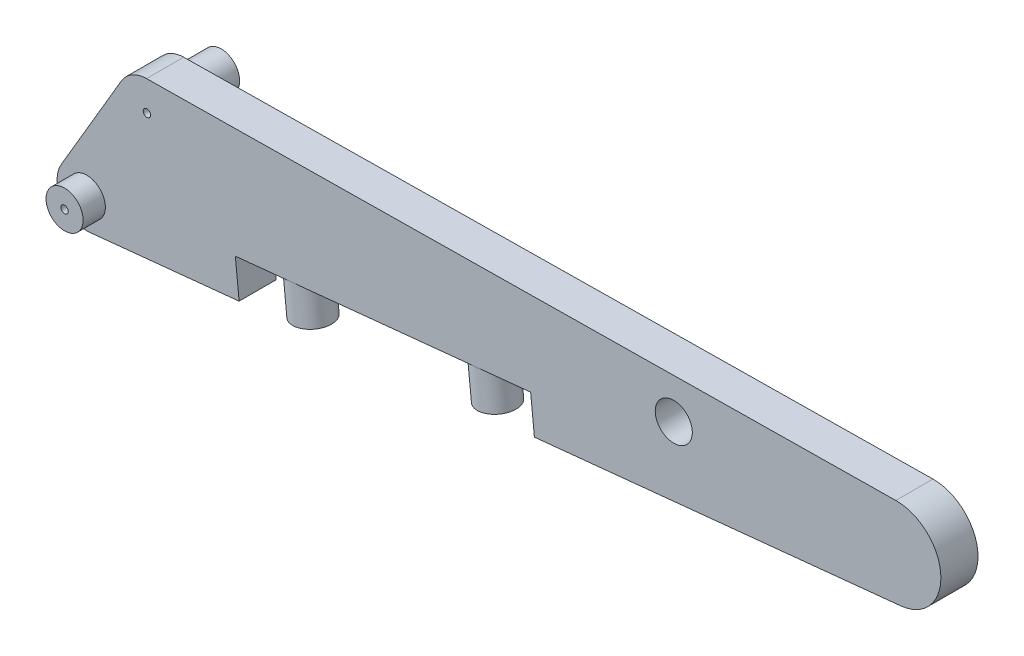
ISO-10303-21;
HEADER;
FILE_DESCRIPTION(('STEP AP214'),'2;1');
FILE_NAME('part.step','',(''),(''),'','','');
FILE_SCHEMA(('AUTOMOTIVE_DESIGN { 1 0 10303 214 1 1 1 1 }'));
ENDSEC;
DATA;
#1=APPLICATION_CONTEXT('core data for automotive mechanical design processes');
#2=APPLICATION_PROTOCOL_DEFINITION('international standard','automotive_design',2000,#1);
#3=PRODUCT_CONTEXT('',#1,'mechanical');
#4=PRODUCT('Part','Part','',(#3));
#5=PRODUCT_RELATED_PRODUCT_CATEGORY('part','',(#4));
#6=PRODUCT_DEFINITION_FORMATION('','',#4);
#7=PRODUCT_DEFINITION_CONTEXT('part definition',#1,'design');
#8=PRODUCT_DEFINITION('design','',#6,#7);
#9=PRODUCT_DEFINITION_SHAPE('','',#8);
#10=(LENGTH_UNIT() NAMED_UNIT(*) SI_UNIT(.MILLI.,.METRE.));
#11=(NAMED_UNIT(*) PLANE_ANGLE_UNIT() SI_UNIT($,.RADIAN.));
#12=(NAMED_UNIT(*) SI_UNIT($,.STERADIAN.) SOLID_ANGLE_UNIT());
#13=UNCERTAINTY_MEASURE_WITH_UNIT(LENGTH_MEASURE(1.E-05),#10,'distance_accuracy_value','');
#14=(GEOMETRIC_REPRESENTATION_CONTEXT(3) GLOBAL_UNCERTAINTY_ASSIGNED_CONTEXT((#13)) GLOBAL_UNIT_ASSIGNED_CONTEXT((#10,
#11,#12)) REPRESENTATION_CONTEXT('',''));
#15=CARTESIAN_POINT('',(0.,0.,0.));
#16=DIRECTION('',(0.,0.,1.));
#17=DIRECTION('',(1.,0.,0.));
#18=AXIS2_PLACEMENT_3D('',#15,#16,#17);
#19=CARTESIAN_POINT('',(51.7116012889555,-6.71364717651734,5.));
#20=DIRECTION('',(-0.100674217274695,0.994919444968349,0.));
#21=DIRECTION('',(-0.994919444968349,-0.100674217274695,0.));
#22=AXIS2_PLACEMENT_3D('',#19,#20,#21);
#23=PLANE('',#22);
#24=CARTESIAN_POINT('',(44.2497054516929,-7.46870380607755,2.5));
#25=DIRECTION('',(0.100674217274695,-0.994919444968349,0.));
#26=DIRECTION('',(0.994919444968349,0.100674217274695,0.));
#27=AXIS2_PLACEMENT_3D('',#24,#25,#26);
#28=CIRCLE('',#27,2.5);
#29=CARTESIAN_POINT('',(44.2497054516929,-7.46870380607755,0.));
#30=VERTEX_POINT('',#29);
#31=CARTESIAN_POINT('',(44.2497054516929,-7.46870380607755,5.));
#32=VERTEX_POINT('',#31);
#33=EDGE_CURVE('E150',#30,#32,#28,.T.);
#34=ORIENTED_EDGE('',*,*,#33,.F.);
#35=DIRECTION('',(0.994919444968349,0.100674217274695,0.));
#36=VECTOR('',#35,1.);
#37=CARTESIAN_POINT('',(51.7116012889555,-6.71364717651734,0.));
#38=LINE('',#37,#36);
#39=CARTESIAN_POINT('',(51.7116012889555,-6.71364717651734,0.));
#40=VERTEX_POINT('',#39);
#41=EDGE_CURVE('E136',#30,#40,#38,.T.);
#42=ORIENTED_EDGE('',*,*,#41,.T.);
#43=DIRECTION('',(0.,0.,-1.));
#44=VECTOR('',#43,1.);
#45=CARTESIAN_POINT('',(51.7116012889555,-6.71364717651734,5.));
#46=LINE('',#45,#44);
#47=CARTESIAN_POINT('',(51.7116012889555,-6.71364717651734,5.));
#48=VERTEX_POINT('',#47);
#49=EDGE_CURVE('E199',#48,#40,#46,.T.);
#50=ORIENTED_EDGE('',*,*,#49,.F.);
#51=DIRECTION('',(0.994919444968349,0.100674217274695,0.));
#52=VECTOR('',#51,1.);
#53=CARTESIAN_POINT('',(51.7116012889555,-6.71364717651734,5.));
#54=LINE('',#53,#52);
#55=EDGE_CURVE('E151',#32,#48,#54,.T.);
#56=ORIENTED_EDGE('',*,*,#55,.F.);
#57=EDGE_LOOP('',(#34,#42,#50,#56));
#58=FACE_BOUND('',#57,.T.);
#59=ADVANCED_FACE('F39',(#58),#23,.F.);
#60=EDGE_CURVE('E55',#32,#30,#28,.T.);
#61=ORIENTED_EDGE('',*,*,#60,.F.);
#62=CARTESIAN_POINT('',(19.3767193274842,-9.98555923794492,5.));
#63=VERTEX_POINT('',#62);
#64=EDGE_CURVE('E192',#63,#32,#54,.T.);
#65=ORIENTED_EDGE('',*,*,#64,.F.);
#66=CARTESIAN_POINT('',(19.3767193274842,-9.98555923794492,2.5));
#67=DIRECTION('',(-0.100674217274695,0.994919444968349,0.));
#68=DIRECTION('',(-0.994919444968349,-0.100674217274695,0.));
#69=AXIS2_PLACEMENT_3D('',#66,#67,#68);
#70=CIRCLE('',#69,2.5);
#71=CARTESIAN_POINT('',(19.3767193274842,-9.98555923794491,0.));
#72=VERTEX_POINT('',#71);
#73=EDGE_CURVE('E11',#72,#63,#70,.F.);
#74=ORIENTED_EDGE('',*,*,#73,.F.);
#75=EDGE_CURVE('E129',#72,#30,#38,.T.);
#76=ORIENTED_EDGE('',*,*,#75,.T.);
#77=EDGE_LOOP('',(#61,#65,#74,#76));
#78=FACE_BOUND('',#77,.T.);
#79=ADVANCED_FACE('F131',(#78),#23,.F.);
#80=CARTESIAN_POINT('',(101.604045303648,-6.71631045273919,5.));
#81=DIRECTION('',(-0.100674217274695,0.994919444968349,0.));
#82=DIRECTION('',(-0.994919444968349,-0.100674217274695,0.));
#83=AXIS2_PLACEMENT_3D('',#80,#81,#82);
#84=PLANE('',#83);
#85=DIRECTION('',(0.994919444968349,0.100674217274695,0.));
#86=VECTOR('',#85,1.);
#87=CARTESIAN_POINT('',(101.604045303648,-6.71631045273919,5.));
#88=LINE('',#87,#86);
#89=CARTESIAN_POINT('',(52.2175428392179,-11.7136471765173,5.));
#90=VERTEX_POINT('',#89);
#91=CARTESIAN_POINT('',(101.604045303648,-6.71631045273919,5.));
#92=VERTEX_POINT('',#91);
#93=EDGE_CURVE('E263',#90,#92,#88,.T.);
#94=ORIENTED_EDGE('',*,*,#93,.F.);
#95=DIRECTION('',(0.,0.,-1.));
#96=VECTOR('',#95,1.);
#97=CARTESIAN_POINT('',(52.2175428392179,-11.7136471765173,5.));
#98=LINE('',#97,#96);
#99=CARTESIAN_POINT('',(52.2175428392179,-11.7136471765173,0.));
#100=VERTEX_POINT('',#99);
#101=EDGE_CURVE('E191',#90,#100,#98,.T.);
#102=ORIENTED_EDGE('',*,*,#101,.T.);
#103=DIRECTION('',(0.994919444968349,0.100674217274695,0.));
#104=VECTOR('',#103,1.);
#105=CARTESIAN_POINT('',(101.604045303648,-6.71631045273919,0.));
#106=LINE('',#105,#104);
#107=CARTESIAN_POINT('',(101.604045303648,-6.71631045273919,0.));
#108=VERTEX_POINT('',#107);
#109=EDGE_CURVE('E284',#100,#108,#106,.T.);
#110=ORIENTED_EDGE('',*,*,#109,.T.);
#111=DIRECTION('',(0.,0.,-1.));
#112=VECTOR('',#111,1.);
#113=CARTESIAN_POINT('',(101.604045303648,-6.71631045273919,5.));
#114=LINE('',#113,#112);
#115=EDGE_CURVE('E301',#92,#108,#114,.T.);
#116=ORIENTED_EDGE('',*,*,#115,.F.);
#117=EDGE_LOOP('',(#94,#102,#110,#116));
#118=FACE_BOUND('',#117,.T.);
#119=ADVANCED_FACE('F354',(#118),#84,.F.);
#120=CARTESIAN_POINT('',(0.,0.,5.));
#121=DIRECTION('',(0.,0.,1.));
#122=DIRECTION('',(1.,0.,0.));
#123=AXIS2_PLACEMENT_3D('',#120,#121,#122);
#124=PLANE('',#123);
#125=DIRECTION('',(0.100674217274696,-0.994919444968349,0.));
#126=VECTOR('',#125,1.);
#127=CARTESIAN_POINT('',(52.2175428392179,-11.7136471765173,5.));
#128=LINE('',#127,#126);
#129=EDGE_CURVE('E179',#48,#90,#128,.T.);
#130=ORIENTED_EDGE('',*,*,#129,.T.);
#131=ORIENTED_EDGE('',*,*,#93,.T.);
#132=CARTESIAN_POINT('',(101.,-0.746793782929099,5.));
#133=DIRECTION('',(0.,0.,1.));
#134=DIRECTION('',(1.,0.,0.));
#135=AXIS2_PLACEMENT_3D('',#132,#133,#134);
#136=CIRCLE('',#135,6.);
#137=CARTESIAN_POINT('',(100.925548690376,5.25274428283023,5.));
#138=VERTEX_POINT('',#137);
#139=EDGE_CURVE('E268',#92,#138,#136,.T.);
#140=ORIENTED_EDGE('',*,*,#139,.T.);
#141=DIRECTION('',(-0.999923010959889,-0.0124085516040338,0.));
#142=VECTOR('',#141,1.);
#143=CARTESIAN_POINT('',(-0.0496342064161348,3.99969204383956,5.));
#144=LINE('',#143,#142);
#145=CARTESIAN_POINT('',(-0.0496342064161348,3.99969204383956,5.));
#146=VERTEX_POINT('',#145);
#147=EDGE_CURVE('E271',#138,#146,#144,.T.);
#148=ORIENTED_EDGE('',*,*,#147,.T.);
#149=CARTESIAN_POINT('',(0.,0.,5.));
#150=DIRECTION('',(0.,0.,1.));
#151=DIRECTION('',(1.,0.,0.));
#152=AXIS2_PLACEMENT_3D('',#149,#150,#151);
#153=CIRCLE('',#152,4.);
#154=CARTESIAN_POINT('',(-3.44921933423754,2.02555819080123,5.));
#155=VERTEX_POINT('',#154);
#156=EDGE_CURVE('E252',#146,#155,#153,.T.);
#157=ORIENTED_EDGE('',*,*,#156,.T.);
#158=DIRECTION('',(-0.506389547700307,-0.862304833559385,0.));
#159=VECTOR('',#158,1.);
#160=CARTESIAN_POINT('',(-11.5514520974424,-11.7713191461489,5.));
#161=LINE('',#160,#159);
#162=CARTESIAN_POINT('',(-11.5514520974424,-11.7713191461489,5.));
#163=VERTEX_POINT('',#162);
#164=EDGE_CURVE('E256',#155,#163,#161,.T.);
#165=ORIENTED_EDGE('',*,*,#164,.T.);
#166=CARTESIAN_POINT('',(-8.1022327632049,-13.7968773369502,5.));
#167=DIRECTION('',(0.,0.,1.));
#168=DIRECTION('',(1.,0.,0.));
#169=AXIS2_PLACEMENT_3D('',#166,#167,#168);
#170=CIRCLE('',#169,4.);
#171=CARTESIAN_POINT('',(-7.69953589410612,-17.7765551168236,5.));
#172=VERTEX_POINT('',#171);
#173=EDGE_CURVE('E260',#163,#172,#170,.T.);
#174=ORIENTED_EDGE('',*,*,#173,.T.);
#175=CARTESIAN_POINT('',(12.4207650404839,-15.7406158675051,5.));
#176=VERTEX_POINT('',#175);
#177=EDGE_CURVE('E264',#172,#176,#88,.T.);
#178=ORIENTED_EDGE('',*,*,#177,.T.);
#179=DIRECTION('',(-0.100674217274694,0.994919444968349,0.));
#180=VECTOR('',#179,1.);
#181=CARTESIAN_POINT('',(12.4207650404839,-15.7406158675051,5.));
#182=LINE('',#181,#180);
#183=CARTESIAN_POINT('',(11.9148234902215,-10.7406158675051,5.));
#184=VERTEX_POINT('',#183);
#185=EDGE_CURVE('E183',#176,#184,#182,.T.);
#186=ORIENTED_EDGE('',*,*,#185,.T.);
#187=EDGE_CURVE('E187',#184,#63,#54,.T.);
#188=ORIENTED_EDGE('',*,*,#187,.T.);
#189=ORIENTED_EDGE('',*,*,#64,.T.);
#190=ORIENTED_EDGE('',*,*,#55,.T.);
#191=EDGE_LOOP('',(#130,#131,#140,#148,#157,#165,#174,#178,#186,#188,#189,#190));
#192=FACE_BOUND('',#191,.T.);
#193=CARTESIAN_POINT('',(71.,-0.524973847405604,5.));
#194=DIRECTION('',(0.,0.,-1.));
#195=DIRECTION('',(-1.,0.,0.));
#196=AXIS2_PLACEMENT_3D('',#193,#194,#195);
#197=CIRCLE('',#196,2.49999999999999);
#198=CARTESIAN_POINT('',(68.5,-0.524973847405604,5.));
#199=VERTEX_POINT('',#198);
#200=EDGE_CURVE('E212',#199,#199,#197,.T.);
#201=ORIENTED_EDGE('',*,*,#200,.T.);
#202=EDGE_LOOP('',(#201));
#203=FACE_BOUND('',#202,.T.);
#204=CARTESIAN_POINT('',(-8.1022327632049,-13.7968773369502,5.));
#205=DIRECTION('',(0.,0.,1.));
#206=DIRECTION('',(1.,0.,0.));
#207=AXIS2_PLACEMENT_3D('',#204,#205,#206);
#208=CIRCLE('',#207,2.5);
#209=CARTESIAN_POINT('',(-5.6022327632049,-13.7968773369502,5.));
#210=VERTEX_POINT('',#209);
#211=EDGE_CURVE('E247',#210,#210,#208,.T.);
#212=ORIENTED_EDGE('',*,*,#211,.F.);
#213=EDGE_LOOP('',(#212));
#214=FACE_BOUND('',#213,.T.);
#215=CARTESIAN_POINT('',(0.,0.,5.));
#216=DIRECTION('',(0.,0.,1.));
#217=DIRECTION('',(1.,0.,0.));
#218=AXIS2_PLACEMENT_3D('',#215,#216,#217);
#219=CIRCLE('',#218,0.5);
#220=CARTESIAN_POINT('',(0.5,0.,5.));
#221=VERTEX_POINT('',#220);
#222=EDGE_CURVE('E231',#221,#221,#219,.T.);
#223=ORIENTED_EDGE('',*,*,#222,.F.);
#224=EDGE_LOOP('',(#223));
#225=FACE_BOUND('',#224,.T.);
#226=ADVANCED_FACE('F336',(#192,#203,#214,#225),#124,.T.);
#227=CARTESIAN_POINT('',(0.,0.,0.));
#228=DIRECTION('',(0.,0.,1.));
#229=DIRECTION('',(1.,0.,0.));
#230=AXIS2_PLACEMENT_3D('',#227,#228,#229);
#231=PLANE('',#230);
#232=CARTESIAN_POINT('',(71.,-0.524973847405604,0.));
#233=DIRECTION('',(0.,0.,-1.));
#234=DIRECTION('',(-1.,0.,0.));
#235=AXIS2_PLACEMENT_3D('',#232,#233,#234);
#236=CIRCLE('',#235,2.49999999999999);
#237=CARTESIAN_POINT('',(68.5,-0.524973847405604,0.));
#238=VERTEX_POINT('',#237);
#239=EDGE_CURVE('E202',#238,#238,#236,.T.);
#240=ORIENTED_EDGE('',*,*,#239,.F.);
#241=EDGE_LOOP('',(#240));
#242=FACE_BOUND('',#241,.T.);
#243=ORIENTED_EDGE('',*,*,#109,.F.);
#244=DIRECTION('',(0.100674217274696,-0.994919444968349,0.));
#245=VECTOR('',#244,1.);
#246=CARTESIAN_POINT('',(52.2175428392179,-11.7136471765173,0.));
#247=LINE('',#246,#245);
#248=EDGE_CURVE('E143',#40,#100,#247,.T.);
#249=ORIENTED_EDGE('',*,*,#248,.F.);
#250=ORIENTED_EDGE('',*,*,#41,.F.);
#251=ORIENTED_EDGE('',*,*,#75,.F.);
#252=CARTESIAN_POINT('',(11.9148234902215,-10.7406158675051,0.));
#253=VERTEX_POINT('',#252);
#254=EDGE_CURVE('E135',#253,#72,#38,.T.);
#255=ORIENTED_EDGE('',*,*,#254,.F.);
#256=DIRECTION('',(-0.100674217274694,0.994919444968349,0.));
#257=VECTOR('',#256,1.);
#258=CARTESIAN_POINT('',(12.4207650404839,-15.7406158675051,0.));
#259=LINE('',#258,#257);
#260=CARTESIAN_POINT('',(12.4207650404839,-15.7406158675051,0.));
#261=VERTEX_POINT('',#260);
#262=EDGE_CURVE('E148',#261,#253,#259,.T.);
#263=ORIENTED_EDGE('',*,*,#262,.F.);
#264=CARTESIAN_POINT('',(-7.69953589410612,-17.7765551168236,0.));
#265=VERTEX_POINT('',#264);
#266=EDGE_CURVE('E285',#265,#261,#106,.T.);
#267=ORIENTED_EDGE('',*,*,#266,.F.);
#268=CARTESIAN_POINT('',(-8.1022327632049,-13.7968773369502,0.));
#269=DIRECTION('',(0.,0.,1.));
#270=DIRECTION('',(1.,0.,0.));
#271=AXIS2_PLACEMENT_3D('',#268,#269,#270);
#272=CIRCLE('',#271,4.);
#273=CARTESIAN_POINT('',(-11.5514520974424,-11.7713191461489,0.));
#274=VERTEX_POINT('',#273);
#275=EDGE_CURVE('E281',#274,#265,#272,.T.);
#276=ORIENTED_EDGE('',*,*,#275,.F.);
#277=DIRECTION('',(-0.506389547700307,-0.862304833559385,0.));
#278=VECTOR('',#277,1.);
#279=CARTESIAN_POINT('',(-11.5514520974424,-11.7713191461489,0.));
#280=LINE('',#279,#278);
#281=CARTESIAN_POINT('',(-3.44921933423754,2.02555819080123,0.));
#282=VERTEX_POINT('',#281);
#283=EDGE_CURVE('E278',#282,#274,#280,.T.);
#284=ORIENTED_EDGE('',*,*,#283,.F.);
#285=CARTESIAN_POINT('',(0.,0.,0.));
#286=DIRECTION('',(0.,0.,1.));
#287=DIRECTION('',(1.,0.,0.));
#288=AXIS2_PLACEMENT_3D('',#285,#286,#287);
#289=CIRCLE('',#288,4.);
#290=CARTESIAN_POINT('',(-0.0496342064161348,3.99969204383956,0.));
#291=VERTEX_POINT('',#290);
#292=EDGE_CURVE('E251',#291,#282,#289,.T.);
#293=ORIENTED_EDGE('',*,*,#292,.F.);
#294=DIRECTION('',(-0.999923010959889,-0.0124085516040338,0.));
#295=VECTOR('',#294,1.);
#296=CARTESIAN_POINT('',(-0.0496342064161348,3.99969204383956,0.));
#297=LINE('',#296,#295);
#298=CARTESIAN_POINT('',(100.925548690376,5.25274428283023,0.));
#299=VERTEX_POINT('',#298);
#300=EDGE_CURVE('E257',#299,#291,#297,.T.);
#301=ORIENTED_EDGE('',*,*,#300,.F.);
#302=CARTESIAN_POINT('',(101.,-0.746793782929099,0.));
#303=DIRECTION('',(0.,0.,1.));
#304=DIRECTION('',(1.,0.,0.));
#305=AXIS2_PLACEMENT_3D('',#302,#303,#304);
#306=CIRCLE('',#305,6.);
#307=EDGE_CURVE('E289',#108,#299,#306,.T.);
#308=ORIENTED_EDGE('',*,*,#307,.F.);
#309=EDGE_LOOP('',(#243,#249,#250,#251,#255,#263,#267,#276,#284,#293,#301,#308));
#310=FACE_BOUND('',#309,.T.);
#311=CARTESIAN_POINT('',(0.,0.,0.));
#312=DIRECTION('',(0.,0.,1.));
#313=DIRECTION('',(1.,0.,0.));
#314=AXIS2_PLACEMENT_3D('',#311,#312,#313);
#315=CIRCLE('',#314,2.5);
#316=CARTESIAN_POINT('',(2.5,0.,0.));
#317=VERTEX_POINT('',#316);
#318=EDGE_CURVE('E243',#317,#317,#315,.T.);
#319=ORIENTED_EDGE('',*,*,#318,.T.);
#320=EDGE_LOOP('',(#319));
#321=FACE_BOUND('',#320,.T.);
#322=CARTESIAN_POINT('',(-8.1022327632049,-13.7968773369502,0.));
#323=DIRECTION('',(0.,0.,-1.));
#324=DIRECTION('',(-1.,0.,0.));
#325=AXIS2_PLACEMENT_3D('',#322,#323,#324);
#326=CIRCLE('',#325,0.500000000000003);
#327=CARTESIAN_POINT('',(-8.60223276320491,-13.7968773369502,0.));
#328=VERTEX_POINT('',#327);
#329=EDGE_CURVE('E216',#328,#328,#326,.T.);
#330=ORIENTED_EDGE('',*,*,#329,.F.);
#331=EDGE_LOOP('',(#330));
#332=FACE_BOUND('',#331,.T.);
#333=ADVANCED_FACE('F141',(#242,#310,#321,#332),#231,.F.);
#334=CARTESIAN_POINT('',(0.,0.,5.));
#335=DIRECTION('',(0.,0.,-1.));
#336=DIRECTION('',(-1.,0.,0.));
#337=AXIS2_PLACEMENT_3D('',#334,#335,#336);
#338=CYLINDRICAL_SURFACE('',#337,4.);
#339=ORIENTED_EDGE('',*,*,#292,.T.);
#340=DIRECTION('',(0.,0.,-1.));
#341=VECTOR('',#340,1.);
#342=CARTESIAN_POINT('',(-3.44921933423754,2.02555819080123,5.));
#343=LINE('',#342,#341);
#344=EDGE_CURVE('E48',#155,#282,#343,.T.);
#345=ORIENTED_EDGE('',*,*,#344,.F.);
#346=ORIENTED_EDGE('',*,*,#156,.F.);
#347=DIRECTION('',(0.,0.,-1.));
#348=VECTOR('',#347,1.);
#349=CARTESIAN_POINT('',(-0.0496342064161348,3.99969204383956,5.));
#350=LINE('',#349,#348);
#351=EDGE_CURVE('E274',#146,#291,#350,.T.);
#352=ORIENTED_EDGE('',*,*,#351,.T.);
#353=EDGE_LOOP('',(#339,#345,#346,#352));
#354=FACE_BOUND('',#353,.T.);
#355=ADVANCED_FACE('F41',(#354),#338,.T.);
#356=CARTESIAN_POINT('',(-11.5514520974424,-11.7713191461489,5.));
#357=DIRECTION('',(0.862304833559385,-0.506389547700307,0.));
#358=DIRECTION('',(0.506389547700307,0.862304833559385,0.));
#359=AXIS2_PLACEMENT_3D('',#356,#357,#358);
#360=PLANE('',#359);
#361=ORIENTED_EDGE('',*,*,#283,.T.);
#362=DIRECTION('',(0.,0.,-1.));
#363=VECTOR('',#362,1.);
#364=CARTESIAN_POINT('',(-11.5514520974424,-11.7713191461489,5.));
#365=LINE('',#364,#363);
#366=EDGE_CURVE('E309',#163,#274,#365,.T.);
#367=ORIENTED_EDGE('',*,*,#366,.F.);
#368=ORIENTED_EDGE('',*,*,#164,.F.);
#369=ORIENTED_EDGE('',*,*,#344,.T.);
#370=EDGE_LOOP('',(#361,#367,#368,#369));
#371=FACE_BOUND('',#370,.T.);
#372=ADVANCED_FACE('F316',(#371),#360,.F.);
#373=CARTESIAN_POINT('',(-8.1022327632049,-13.7968773369502,5.));
#374=DIRECTION('',(0.,0.,-1.));
#375=DIRECTION('',(-1.,0.,0.));
#376=AXIS2_PLACEMENT_3D('',#373,#374,#375);
#377=CYLINDRICAL_SURFACE('',#376,4.);
#378=ORIENTED_EDGE('',*,*,#275,.T.);
#379=DIRECTION('',(0.,0.,-1.));
#380=VECTOR('',#379,1.);
#381=CARTESIAN_POINT('',(-7.69953589410612,-17.7765551168236,5.));
#382=LINE('',#381,#380);
#383=EDGE_CURVE('E305',#172,#265,#382,.T.);
#384=ORIENTED_EDGE('',*,*,#383,.F.);
#385=ORIENTED_EDGE('',*,*,#173,.F.);
#386=ORIENTED_EDGE('',*,*,#366,.T.);
#387=EDGE_LOOP('',(#378,#384,#385,#386));
#388=FACE_BOUND('',#387,.T.);
#389=ADVANCED_FACE('F329',(#388),#377,.T.);
#390=ORIENTED_EDGE('',*,*,#266,.T.);
#391=DIRECTION('',(0.,0.,-1.));
#392=VECTOR('',#391,1.);
#393=CARTESIAN_POINT('',(12.4207650404839,-15.7406158675051,5.));
#394=LINE('',#393,#392);
#395=EDGE_CURVE('E206',#176,#261,#394,.T.);
#396=ORIENTED_EDGE('',*,*,#395,.F.);
#397=ORIENTED_EDGE('',*,*,#177,.F.);
#398=ORIENTED_EDGE('',*,*,#383,.T.);
#399=EDGE_LOOP('',(#390,#396,#397,#398));
#400=FACE_BOUND('',#399,.T.);
#401=ADVANCED_FACE('F333',(#400),#84,.F.);
#402=CARTESIAN_POINT('',(101.,-0.746793782929099,5.));
#403=DIRECTION('',(0.,0.,-1.));
#404=DIRECTION('',(-1.,0.,0.));
#405=AXIS2_PLACEMENT_3D('',#402,#403,#404);
#406=CYLINDRICAL_SURFACE('',#405,6.);
#407=ORIENTED_EDGE('',*,*,#307,.T.);
#408=DIRECTION('',(0.,0.,-1.));
#409=VECTOR('',#408,1.);
#410=CARTESIAN_POINT('',(100.925548690376,5.25274428283023,5.));
#411=LINE('',#410,#409);
#412=EDGE_CURVE('E297',#138,#299,#411,.T.);
#413=ORIENTED_EDGE('',*,*,#412,.F.);
#414=ORIENTED_EDGE('',*,*,#139,.F.);
#415=ORIENTED_EDGE('',*,*,#115,.T.);
#416=EDGE_LOOP('',(#407,#413,#414,#415));
#417=FACE_BOUND('',#416,.T.);
#418=ADVANCED_FACE('F344',(#417),#406,.T.);
#419=CARTESIAN_POINT('',(-0.0496342064161348,3.99969204383956,5.));
#420=DIRECTION('',(0.0124085516040338,-0.999923010959889,0.));
#421=DIRECTION('',(0.999923010959889,0.0124085516040338,0.));
#422=AXIS2_PLACEMENT_3D('',#419,#420,#421);
#423=PLANE('',#422);
#424=ORIENTED_EDGE('',*,*,#300,.T.);
#425=ORIENTED_EDGE('',*,*,#351,.F.);
#426=ORIENTED_EDGE('',*,*,#147,.F.);
#427=ORIENTED_EDGE('',*,*,#412,.T.);
#428=EDGE_LOOP('',(#424,#425,#426,#427));
#429=FACE_BOUND('',#428,.T.);
#430=ADVANCED_FACE('F342',(#429),#423,.F.);
#431=CARTESIAN_POINT('',(0.,0.,-5.));
#432=DIRECTION('',(0.,0.,1.));
#433=DIRECTION('',(1.,0.,0.));
#434=AXIS2_PLACEMENT_3D('',#431,#432,#433);
#435=CYLINDRICAL_SURFACE('',#434,2.5);
#436=CARTESIAN_POINT('',(0.,0.,-5.));
#437=DIRECTION('',(0.,0.,1.));
#438=DIRECTION('',(1.,0.,0.));
#439=AXIS2_PLACEMENT_3D('',#436,#437,#438);
#440=CIRCLE('',#439,2.5);
#441=CARTESIAN_POINT('',(2.5,0.,-5.));
#442=VERTEX_POINT('',#441);
#443=EDGE_CURVE('E236',#442,#442,#440,.T.);
#444=ORIENTED_EDGE('',*,*,#443,.T.);
#445=EDGE_LOOP('',(#444));
#446=FACE_BOUND('',#445,.T.);
#447=ORIENTED_EDGE('',*,*,#318,.F.);
#448=EDGE_LOOP('',(#447));
#449=FACE_BOUND('',#448,.T.);
#450=ADVANCED_FACE('F566',(#446,#449),#435,.T.);
#451=CARTESIAN_POINT('',(0.,0.,-5.));
#452=DIRECTION('',(0.,0.,1.));
#453=DIRECTION('',(1.,0.,0.));
#454=AXIS2_PLACEMENT_3D('',#451,#452,#453);
#455=PLANE('',#454);
#456=CARTESIAN_POINT('',(0.,0.,-5.));
#457=DIRECTION('',(0.,0.,1.));
#458=DIRECTION('',(1.,0.,0.));
#459=AXIS2_PLACEMENT_3D('',#456,#457,#458);
#460=CIRCLE('',#459,0.5);
#461=CARTESIAN_POINT('',(0.5,0.,-5.));
#462=VERTEX_POINT('',#461);
#463=EDGE_CURVE('E232',#462,#462,#460,.T.);
#464=ORIENTED_EDGE('',*,*,#463,.T.);
#465=EDGE_LOOP('',(#464));
#466=FACE_BOUND('',#465,.T.);
#467=ORIENTED_EDGE('',*,*,#443,.F.);
#468=EDGE_LOOP('',(#467));
#469=FACE_BOUND('',#468,.T.);
#470=ADVANCED_FACE('F556',(#466,#469),#455,.F.);
#471=CARTESIAN_POINT('',(0.,0.,-5.));
#472=DIRECTION('',(0.,0.,1.));
#473=DIRECTION('',(1.,0.,0.));
#474=AXIS2_PLACEMENT_3D('',#471,#472,#473);
#475=CYLINDRICAL_SURFACE('',#474,0.5);
#476=ORIENTED_EDGE('',*,*,#463,.F.);
#477=EDGE_LOOP('',(#476));
#478=FACE_BOUND('',#477,.T.);
#479=ORIENTED_EDGE('',*,*,#222,.T.);
#480=EDGE_LOOP('',(#479));
#481=FACE_BOUND('',#480,.T.);
#482=ADVANCED_FACE('F547',(#478,#481),#475,.F.);
#483=CARTESIAN_POINT('',(-8.1022327632049,-13.7968773369502,8.));
#484=DIRECTION('',(0.,0.,-1.));
#485=DIRECTION('',(-1.,0.,0.));
#486=AXIS2_PLACEMENT_3D('',#483,#484,#485);
#487=CYLINDRICAL_SURFACE('',#486,2.5);
#488=ORIENTED_EDGE('',*,*,#211,.T.);
#489=EDGE_LOOP('',(#488));
#490=FACE_BOUND('',#489,.T.);
#491=CARTESIAN_POINT('',(-8.1022327632049,-13.7968773369502,8.));
#492=DIRECTION('',(0.,0.,-1.));
#493=DIRECTION('',(-1.,0.,0.));
#494=AXIS2_PLACEMENT_3D('',#491,#492,#493);
#495=CIRCLE('',#494,2.5);
#496=CARTESIAN_POINT('',(-10.6022327632049,-13.7968773369502,8.));
#497=VERTEX_POINT('',#496);
#498=EDGE_CURVE('E224',#497,#497,#495,.T.);
#499=ORIENTED_EDGE('',*,*,#498,.T.);
#500=EDGE_LOOP('',(#499));
#501=FACE_BOUND('',#500,.T.);
#502=ADVANCED_FACE('F539',(#490,#501),#487,.T.);
#503=CARTESIAN_POINT('',(-8.1022327632049,-13.7968773369502,8.));
#504=DIRECTION('',(0.,0.,-1.));
#505=DIRECTION('',(-1.,0.,0.));
#506=AXIS2_PLACEMENT_3D('',#503,#504,#505);
#507=PLANE('',#506);
#508=CARTESIAN_POINT('',(-8.1022327632049,-13.7968773369502,8.));
#509=DIRECTION('',(0.,0.,-1.));
#510=DIRECTION('',(-1.,0.,0.));
#511=AXIS2_PLACEMENT_3D('',#508,#509,#510);
#512=CIRCLE('',#511,0.500000000000003);
#513=CARTESIAN_POINT('',(-8.60223276320491,-13.7968773369502,8.));
#514=VERTEX_POINT('',#513);
#515=EDGE_CURVE('E220',#514,#514,#512,.T.);
#516=ORIENTED_EDGE('',*,*,#515,.T.);
#517=EDGE_LOOP('',(#516));
#518=FACE_BOUND('',#517,.T.);
#519=ORIENTED_EDGE('',*,*,#498,.F.);
#520=EDGE_LOOP('',(#519));
#521=FACE_BOUND('',#520,.T.);
#522=ADVANCED_FACE('F531',(#518,#521),#507,.F.);
#523=CARTESIAN_POINT('',(-8.1022327632049,-13.7968773369502,8.));
#524=DIRECTION('',(0.,0.,-1.));
#525=DIRECTION('',(-1.,0.,0.));
#526=AXIS2_PLACEMENT_3D('',#523,#524,#525);
#527=CYLINDRICAL_SURFACE('',#526,0.500000000000003);
#528=ORIENTED_EDGE('',*,*,#515,.F.);
#529=EDGE_LOOP('',(#528));
#530=FACE_BOUND('',#529,.T.);
#531=ORIENTED_EDGE('',*,*,#329,.T.);
#532=EDGE_LOOP('',(#531));
#533=FACE_BOUND('',#532,.T.);
#534=ADVANCED_FACE('F522',(#530,#533),#527,.F.);
#535=CARTESIAN_POINT('',(71.,-0.524973847405604,5.));
#536=DIRECTION('',(0.,0.,-1.));
#537=DIRECTION('',(-1.,0.,0.));
#538=AXIS2_PLACEMENT_3D('',#535,#536,#537);
#539=CYLINDRICAL_SURFACE('',#538,2.49999999999999);
#540=ORIENTED_EDGE('',*,*,#200,.F.);
#541=EDGE_LOOP('',(#540));
#542=FACE_BOUND('',#541,.T.);
#543=ORIENTED_EDGE('',*,*,#239,.T.);
#544=EDGE_LOOP('',(#543));
#545=FACE_BOUND('',#544,.T.);
#546=ADVANCED_FACE('F386',(#542,#545),#539,.F.);
#547=CARTESIAN_POINT('',(52.2175428392179,-11.7136471765173,5.));
#548=DIRECTION('',(0.994919444968349,0.100674217274696,0.));
#549=DIRECTION('',(-0.100674217274696,0.994919444968349,0.));
#550=AXIS2_PLACEMENT_3D('',#547,#548,#549);
#551=PLANE('',#550);
#552=ORIENTED_EDGE('',*,*,#248,.T.);
#553=ORIENTED_EDGE('',*,*,#101,.F.);
#554=ORIENTED_EDGE('',*,*,#129,.F.);
#555=ORIENTED_EDGE('',*,*,#49,.T.);
#556=EDGE_LOOP('',(#552,#553,#554,#555));
#557=FACE_BOUND('',#556,.T.);
#558=ADVANCED_FACE('F353',(#557),#551,.F.);
#559=CARTESIAN_POINT('',(19.3767193274842,-9.98555923794491,2.5));
#560=DIRECTION('',(0.100674217274695,-0.994919444968349,0.));
#561=DIRECTION('',(0.994919444968349,0.100674217274695,0.));
#562=AXIS2_PLACEMENT_3D('',#559,#560,#561);
#563=CIRCLE('',#562,2.5);
#564=EDGE_CURVE('E63',#63,#72,#563,.T.);
#565=ORIENTED_EDGE('',*,*,#564,.F.);
#566=ORIENTED_EDGE('',*,*,#187,.F.);
#567=DIRECTION('',(0.,0.,-1.));
#568=VECTOR('',#567,1.);
#569=CARTESIAN_POINT('',(11.9148234902215,-10.7406158675051,5.));
#570=LINE('',#569,#568);
#571=EDGE_CURVE('E203',#184,#253,#570,.T.);
#572=ORIENTED_EDGE('',*,*,#571,.T.);
#573=ORIENTED_EDGE('',*,*,#254,.T.);
#574=EDGE_LOOP('',(#565,#566,#572,#573));
#575=FACE_BOUND('',#574,.T.);
#576=ADVANCED_FACE('F370',(#575),#23,.F.);
#577=CARTESIAN_POINT('',(12.4207650404839,-15.7406158675051,5.));
#578=DIRECTION('',(-0.994919444968349,-0.100674217274694,0.));
#579=DIRECTION('',(0.100674217274694,-0.994919444968349,0.));
#580=AXIS2_PLACEMENT_3D('',#577,#578,#579);
#581=PLANE('',#580);
#582=ORIENTED_EDGE('',*,*,#262,.T.);
#583=ORIENTED_EDGE('',*,*,#571,.F.);
#584=ORIENTED_EDGE('',*,*,#185,.F.);
#585=ORIENTED_EDGE('',*,*,#395,.T.);
#586=EDGE_LOOP('',(#582,#583,#584,#585));
#587=FACE_BOUND('',#586,.T.);
#588=ADVANCED_FACE('F379',(#587),#581,.F.);
#589=CARTESIAN_POINT('',(19.8800904138576,-14.9601564627867,2.5));
#590=DIRECTION('',(0.100674217274695,-0.994919444968349,0.));
#591=DIRECTION('',(0.994919444968349,0.100674217274695,0.));
#592=AXIS2_PLACEMENT_3D('',#589,#590,#591);
#593=PLANE('',#592);
#594=CARTESIAN_POINT('',(19.8800904138576,-14.9601564627867,2.5));
#595=DIRECTION('',(0.100674217274695,-0.994919444968349,0.));
#596=DIRECTION('',(0.994919444968349,0.100674217274695,0.));
#597=AXIS2_PLACEMENT_3D('',#594,#595,#596);
#598=CIRCLE('',#597,2.5);
#599=CARTESIAN_POINT('',(22.3673890262785,-14.7084709195999,2.5));
#600=VERTEX_POINT('',#599);
#601=EDGE_CURVE('E173',#600,#600,#598,.T.);
#602=ORIENTED_EDGE('',*,*,#601,.T.);
#603=EDGE_LOOP('',(#602));
#604=FACE_BOUND('',#603,.T.);
#605=CARTESIAN_POINT('',(19.8800904138576,-14.9601564627867,2.5));
#606=DIRECTION('',(0.100674217274695,-0.994919444968349,0.));
#607=DIRECTION('',(0.994919444968349,0.100674217274695,0.));
#608=AXIS2_PLACEMENT_3D('',#605,#606,#607);
#609=CIRCLE('',#608,0.500000000000001);
#610=CARTESIAN_POINT('',(20.3775501363418,-14.9098193541493,2.5));
#611=VERTEX_POINT('',#610);
#612=EDGE_CURVE('E166',#611,#611,#609,.T.);
#613=ORIENTED_EDGE('',*,*,#612,.F.);
#614=EDGE_LOOP('',(#613));
#615=FACE_BOUND('',#614,.T.);
#616=ADVANCED_FACE('F384',(#604,#615),#593,.T.);
#617=CARTESIAN_POINT('',(19.8800904138576,-14.9601564627867,2.5));
#618=DIRECTION('',(-0.100674217274695,0.994919444968349,0.));
#619=DIRECTION('',(-0.994919444968349,-0.100674217274695,0.));
#620=AXIS2_PLACEMENT_3D('',#617,#618,#619);
#621=CYLINDRICAL_SURFACE('',#620,2.5);
#622=ORIENTED_EDGE('',*,*,#601,.F.);
#623=EDGE_LOOP('',(#622));
#624=FACE_BOUND('',#623,.T.);
#625=ORIENTED_EDGE('',*,*,#564,.T.);
#626=ORIENTED_EDGE('',*,*,#73,.T.);
#627=EDGE_LOOP('',(#625,#626));
#628=FACE_BOUND('',#627,.T.);
#629=ADVANCED_FACE('F398',(#624,#628),#621,.T.);
#630=CARTESIAN_POINT('',(19.8800904138576,-14.9601564627867,2.5));
#631=DIRECTION('',(-0.100674217274695,0.994919444968349,0.));
#632=DIRECTION('',(-0.994919444968349,-0.100674217274695,0.));
#633=AXIS2_PLACEMENT_3D('',#630,#631,#632);
#634=CYLINDRICAL_SURFACE('',#633,0.500000000000001);
#635=ORIENTED_EDGE('',*,*,#612,.T.);
#636=EDGE_LOOP('',(#635));
#637=FACE_BOUND('',#636,.T.);
#638=CARTESIAN_POINT('',(19.3767193274842,-9.98555923794491,2.5));
#639=DIRECTION('',(0.100674217274695,-0.994919444968349,0.));
#640=DIRECTION('',(0.994919444968349,0.100674217274695,0.));
#641=AXIS2_PLACEMENT_3D('',#638,#639,#640);
#642=CIRCLE('',#641,0.500000000000001);
#643=CARTESIAN_POINT('',(19.8741790499683,-9.93522212930757,2.5));
#644=VERTEX_POINT('',#643);
#645=EDGE_CURVE('E162',#644,#644,#642,.T.);
#646=ORIENTED_EDGE('',*,*,#645,.F.);
#647=EDGE_LOOP('',(#646));
#648=FACE_BOUND('',#647,.T.);
#649=ADVANCED_FACE('F390',(#637,#648),#634,.F.);
#650=ORIENTED_EDGE('',*,*,#645,.T.);
#651=EDGE_LOOP('',(#650));
#652=FACE_BOUND('',#651,.T.);
#653=ADVANCED_FACE('F364',(#652),#23,.F.);
#654=CARTESIAN_POINT('',(44.7530765380663,-12.4433010309193,2.5));
#655=DIRECTION('',(0.100674217274695,-0.994919444968349,0.));
#656=DIRECTION('',(0.994919444968349,0.100674217274695,0.));
#657=AXIS2_PLACEMENT_3D('',#654,#655,#656);
#658=PLANE('',#657);
#659=CARTESIAN_POINT('',(44.7530765380663,-12.4433010309193,2.5));
#660=DIRECTION('',(0.100674217274695,-0.994919444968349,0.));
#661=DIRECTION('',(0.994919444968349,0.100674217274695,0.));
#662=AXIS2_PLACEMENT_3D('',#659,#660,#661);
#663=CIRCLE('',#662,2.5);
#664=CARTESIAN_POINT('',(47.2403751504872,-12.1916154877326,2.5));
#665=VERTEX_POINT('',#664);
#666=EDGE_CURVE('E159',#665,#665,#663,.T.);
#667=ORIENTED_EDGE('',*,*,#666,.T.);
#668=EDGE_LOOP('',(#667));
#669=FACE_BOUND('',#668,.T.);
#670=CARTESIAN_POINT('',(44.7530765380663,-12.4433010309193,2.5));
#671=DIRECTION('',(0.100674217274695,-0.994919444968349,0.));
#672=DIRECTION('',(0.994919444968349,0.100674217274695,0.));
#673=AXIS2_PLACEMENT_3D('',#670,#671,#672);
#674=CIRCLE('',#673,0.500000000000001);
#675=CARTESIAN_POINT('',(45.2505362605505,-12.3929639222819,2.5));
#676=VERTEX_POINT('',#675);
#677=EDGE_CURVE('E155',#676,#676,#674,.T.);
#678=ORIENTED_EDGE('',*,*,#677,.F.);
#679=EDGE_LOOP('',(#678));
#680=FACE_BOUND('',#679,.T.);
#681=ADVANCED_FACE('F389',(#669,#680),#658,.T.);
#682=CARTESIAN_POINT('',(44.7530765380663,-12.4433010309193,2.5));
#683=DIRECTION('',(-0.100674217274695,0.994919444968349,0.));
#684=DIRECTION('',(-0.994919444968349,-0.100674217274695,0.));
#685=AXIS2_PLACEMENT_3D('',#682,#683,#684);
#686=CYLINDRICAL_SURFACE('',#685,2.5);
#687=ORIENTED_EDGE('',*,*,#666,.F.);
#688=EDGE_LOOP('',(#687));
#689=FACE_BOUND('',#688,.T.);
#690=ORIENTED_EDGE('',*,*,#60,.T.);
#691=ORIENTED_EDGE('',*,*,#33,.T.);
#692=EDGE_LOOP('',(#690,#691));
#693=FACE_BOUND('',#692,.T.);
#694=ADVANCED_FACE('F157',(#689,#693),#686,.T.);
#695=CARTESIAN_POINT('',(44.7530765380663,-12.4433010309193,2.5));
#696=DIRECTION('',(-0.100674217274695,0.994919444968349,0.));
#697=DIRECTION('',(-0.994919444968349,-0.100674217274695,0.));
#698=AXIS2_PLACEMENT_3D('',#695,#696,#697);
#699=CYLINDRICAL_SURFACE('',#698,0.500000000000001);
#700=ORIENTED_EDGE('',*,*,#677,.T.);
#701=EDGE_LOOP('',(#700));
#702=FACE_BOUND('',#701,.T.);
#703=CARTESIAN_POINT('',(44.2497054516929,-7.46870380607755,2.5));
#704=DIRECTION('',(0.100674217274695,-0.994919444968349,0.));
#705=DIRECTION('',(0.994919444968349,0.100674217274695,0.));
#706=AXIS2_PLACEMENT_3D('',#703,#704,#705);
#707=CIRCLE('',#706,0.500000000000001);
#708=CARTESIAN_POINT('',(44.747165174177,-7.4183666974402,2.5));
#709=VERTEX_POINT('',#708);
#710=EDGE_CURVE('E651',#709,#709,#707,.T.);
#711=ORIENTED_EDGE('',*,*,#710,.F.);
#712=EDGE_LOOP('',(#711));
#713=FACE_BOUND('',#712,.T.);
#714=ADVANCED_FACE('F376',(#702,#713),#699,.F.);
#715=ORIENTED_EDGE('',*,*,#710,.T.);
#716=EDGE_LOOP('',(#715));
#717=FACE_BOUND('',#716,.T.);
#718=ADVANCED_FACE('F365',(#717),#23,.F.);
#719=CLOSED_SHELL('',(#59,#79,#119,#226,#333,#355,#372,#389,#401,#418,#430,#450,#470,#482,#502,
#522,#534,#546,#558,#576,#588,#616,#629,#649,#653,#681,#694,#714,#718));
#720=MANIFOLD_SOLID_BREP('B2',#719);
#721=ADVANCED_BREP_SHAPE_REPRESENTATION('',(#18,#720),#14);
#722=SHAPE_DEFINITION_REPRESENTATION(#9,#721);
ENDSEC;
END-ISO-10303-21;
